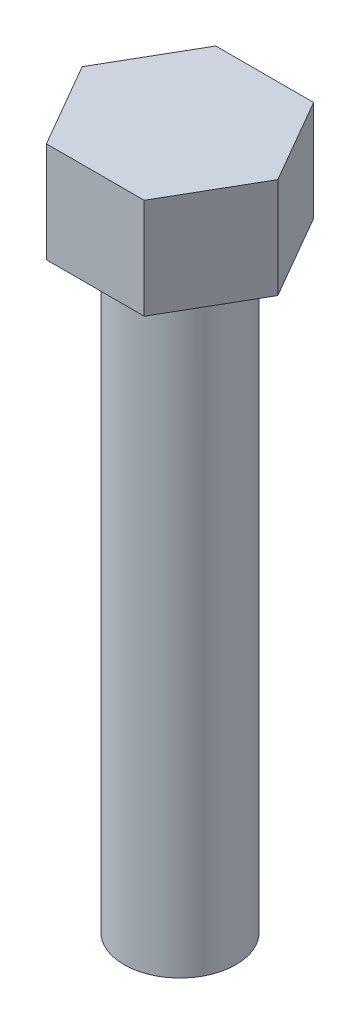
ISO-10303-21;
HEADER;
FILE_DESCRIPTION(('STEP AP214'),'2;1');
FILE_NAME('part.step','',(''),(''),'','','');
FILE_SCHEMA(('AUTOMOTIVE_DESIGN { 1 0 10303 214 1 1 1 1 }'));
ENDSEC;
DATA;
#1=APPLICATION_CONTEXT('core data for automotive mechanical design processes');
#2=APPLICATION_PROTOCOL_DEFINITION('international standard','automotive_design',2000,#1);
#3=PRODUCT_CONTEXT('',#1,'mechanical');
#4=PRODUCT('Part','Part','',(#3));
#5=PRODUCT_RELATED_PRODUCT_CATEGORY('part','',(#4));
#6=PRODUCT_DEFINITION_FORMATION('','',#4);
#7=PRODUCT_DEFINITION_CONTEXT('part definition',#1,'design');
#8=PRODUCT_DEFINITION('design','',#6,#7);
#9=PRODUCT_DEFINITION_SHAPE('','',#8);
#10=(LENGTH_UNIT() NAMED_UNIT(*) SI_UNIT(.MILLI.,.METRE.));
#11=(NAMED_UNIT(*) PLANE_ANGLE_UNIT() SI_UNIT($,.RADIAN.));
#12=(NAMED_UNIT(*) SI_UNIT($,.STERADIAN.) SOLID_ANGLE_UNIT());
#13=UNCERTAINTY_MEASURE_WITH_UNIT(LENGTH_MEASURE(1.E-05),#10,'distance_accuracy_value','');
#14=(GEOMETRIC_REPRESENTATION_CONTEXT(3) GLOBAL_UNCERTAINTY_ASSIGNED_CONTEXT((#13)) GLOBAL_UNIT_ASSIGNED_CONTEXT((#10,
#11,#12)) REPRESENTATION_CONTEXT('',''));
#15=CARTESIAN_POINT('',(0.,0.,0.));
#16=DIRECTION('',(0.,0.,1.));
#17=DIRECTION('',(1.,0.,0.));
#18=AXIS2_PLACEMENT_3D('',#15,#16,#17);
#19=CARTESIAN_POINT('',(2.33749999999999,4.8,-4.04866876269225));
#20=DIRECTION('',(0.,0.,1.));
#21=DIRECTION('',(1.,0.,0.));
#22=AXIS2_PLACEMENT_3D('',#19,#20,#21);
#23=PLANE('',#22);
#24=DIRECTION('',(-1.,0.,0.));
#25=VECTOR('',#24,1.);
#26=CARTESIAN_POINT('',(2.33749999999999,0.,-4.04866876269225));
#27=LINE('',#26,#25);
#28=CARTESIAN_POINT('',(2.33749999999999,0.,-4.04866876269225));
#29=VERTEX_POINT('',#28);
#30=CARTESIAN_POINT('',(-2.33749999999999,0.,-4.04866876269225));
#31=VERTEX_POINT('',#30);
#32=EDGE_CURVE('E129',#29,#31,#27,.T.);
#33=ORIENTED_EDGE('',*,*,#32,.T.);
#34=DIRECTION('',(0.,-1.,0.));
#35=VECTOR('',#34,1.);
#36=CARTESIAN_POINT('',(-2.33749999999999,4.8,-4.04866876269225));
#37=LINE('',#36,#35);
#38=CARTESIAN_POINT('',(-2.33749999999999,4.8,-4.04866876269225));
#39=VERTEX_POINT('',#38);
#40=EDGE_CURVE('E147',#39,#31,#37,.T.);
#41=ORIENTED_EDGE('',*,*,#40,.F.);
#42=DIRECTION('',(-1.,0.,0.));
#43=VECTOR('',#42,1.);
#44=CARTESIAN_POINT('',(2.33749999999999,4.8,-4.04866876269225));
#45=LINE('',#44,#43);
#46=CARTESIAN_POINT('',(2.33749999999999,4.8,-4.04866876269225));
#47=VERTEX_POINT('',#46);
#48=EDGE_CURVE('E140',#47,#39,#45,.T.);
#49=ORIENTED_EDGE('',*,*,#48,.F.);
#50=DIRECTION('',(0.,-1.,0.));
#51=VECTOR('',#50,1.);
#52=CARTESIAN_POINT('',(2.33749999999999,4.8,-4.04866876269225));
#53=LINE('',#52,#51);
#54=EDGE_CURVE('E125',#47,#29,#53,.T.);
#55=ORIENTED_EDGE('',*,*,#54,.T.);
#56=EDGE_LOOP('',(#33,#41,#49,#55));
#57=FACE_BOUND('',#56,.T.);
#58=ADVANCED_FACE('F43',(#57),#23,.F.);
#59=CARTESIAN_POINT('',(-2.33749999999999,4.8,-4.04866876269225));
#60=DIRECTION('',(0.866025403784438,0.,0.500000000000001));
#61=DIRECTION('',(0.500000000000001,0.,-0.866025403784438));
#62=AXIS2_PLACEMENT_3D('',#59,#60,#61);
#63=PLANE('',#62);
#64=DIRECTION('',(-0.500000000000001,0.,0.866025403784438));
#65=VECTOR('',#64,1.);
#66=CARTESIAN_POINT('',(-2.33749999999999,0.,-4.04866876269225));
#67=LINE('',#66,#65);
#68=CARTESIAN_POINT('',(-4.675,0.,0.));
#69=VERTEX_POINT('',#68);
#70=EDGE_CURVE('E132',#31,#69,#67,.T.);
#71=ORIENTED_EDGE('',*,*,#70,.T.);
#72=DIRECTION('',(0.,-1.,0.));
#73=VECTOR('',#72,1.);
#74=CARTESIAN_POINT('',(-4.675,4.8,0.));
#75=LINE('',#74,#73);
#76=CARTESIAN_POINT('',(-4.675,4.8,0.));
#77=VERTEX_POINT('',#76);
#78=EDGE_CURVE('E144',#77,#69,#75,.T.);
#79=ORIENTED_EDGE('',*,*,#78,.F.);
#80=DIRECTION('',(-0.500000000000001,0.,0.866025403784438));
#81=VECTOR('',#80,1.);
#82=CARTESIAN_POINT('',(-2.33749999999999,4.8,-4.04866876269225));
#83=LINE('',#82,#81);
#84=EDGE_CURVE('E98',#39,#77,#83,.T.);
#85=ORIENTED_EDGE('',*,*,#84,.F.);
#86=ORIENTED_EDGE('',*,*,#40,.T.);
#87=EDGE_LOOP('',(#71,#79,#85,#86));
#88=FACE_BOUND('',#87,.T.);
#89=ADVANCED_FACE('F165',(#88),#63,.F.);
#90=CARTESIAN_POINT('',(-4.675,4.8,0.));
#91=DIRECTION('',(0.866025403784438,0.,-0.500000000000001));
#92=DIRECTION('',(-0.500000000000001,0.,-0.866025403784438));
#93=AXIS2_PLACEMENT_3D('',#90,#91,#92);
#94=PLANE('',#93);
#95=DIRECTION('',(0.500000000000001,0.,0.866025403784438));
#96=VECTOR('',#95,1.);
#97=CARTESIAN_POINT('',(-4.675,0.,0.));
#98=LINE('',#97,#96);
#99=CARTESIAN_POINT('',(-2.33749999999999,0.,4.04866876269225));
#100=VERTEX_POINT('',#99);
#101=EDGE_CURVE('E135',#69,#100,#98,.T.);
#102=ORIENTED_EDGE('',*,*,#101,.T.);
#103=DIRECTION('',(0.,-1.,0.));
#104=VECTOR('',#103,1.);
#105=CARTESIAN_POINT('',(-2.33749999999999,4.8,4.04866876269225));
#106=LINE('',#105,#104);
#107=CARTESIAN_POINT('',(-2.33749999999999,4.8,4.04866876269225));
#108=VERTEX_POINT('',#107);
#109=EDGE_CURVE('E120',#108,#100,#106,.T.);
#110=ORIENTED_EDGE('',*,*,#109,.F.);
#111=DIRECTION('',(0.500000000000001,0.,0.866025403784438));
#112=VECTOR('',#111,1.);
#113=CARTESIAN_POINT('',(-4.675,4.8,0.));
#114=LINE('',#113,#112);
#115=EDGE_CURVE('E111',#77,#108,#114,.T.);
#116=ORIENTED_EDGE('',*,*,#115,.F.);
#117=ORIENTED_EDGE('',*,*,#78,.T.);
#118=EDGE_LOOP('',(#102,#110,#116,#117));
#119=FACE_BOUND('',#118,.T.);
#120=ADVANCED_FACE('F170',(#119),#94,.F.);
#121=CARTESIAN_POINT('',(-2.33749999999999,4.8,4.04866876269225));
#122=DIRECTION('',(0.,0.,-1.));
#123=DIRECTION('',(-1.,0.,0.));
#124=AXIS2_PLACEMENT_3D('',#121,#122,#123);
#125=PLANE('',#124);
#126=DIRECTION('',(1.,0.,0.));
#127=VECTOR('',#126,1.);
#128=CARTESIAN_POINT('',(-2.33749999999999,0.,4.04866876269225));
#129=LINE('',#128,#127);
#130=CARTESIAN_POINT('',(2.33749999999999,0.,4.04866876269225));
#131=VERTEX_POINT('',#130);
#132=EDGE_CURVE('E119',#100,#131,#129,.T.);
#133=ORIENTED_EDGE('',*,*,#132,.T.);
#134=DIRECTION('',(0.,-1.,0.));
#135=VECTOR('',#134,1.);
#136=CARTESIAN_POINT('',(2.33749999999999,4.8,4.04866876269225));
#137=LINE('',#136,#135);
#138=CARTESIAN_POINT('',(2.33749999999999,4.8,4.04866876269225));
#139=VERTEX_POINT('',#138);
#140=EDGE_CURVE('E116',#139,#131,#137,.T.);
#141=ORIENTED_EDGE('',*,*,#140,.F.);
#142=DIRECTION('',(1.,0.,0.));
#143=VECTOR('',#142,1.);
#144=CARTESIAN_POINT('',(-2.33749999999999,4.8,4.04866876269225));
#145=LINE('',#144,#143);
#146=EDGE_CURVE('E105',#108,#139,#145,.T.);
#147=ORIENTED_EDGE('',*,*,#146,.F.);
#148=ORIENTED_EDGE('',*,*,#109,.T.);
#149=EDGE_LOOP('',(#133,#141,#147,#148));
#150=FACE_BOUND('',#149,.T.);
#151=ADVANCED_FACE('F117',(#150),#125,.F.);
#152=CARTESIAN_POINT('',(2.33749999999999,4.8,4.04866876269225));
#153=DIRECTION('',(-0.866025403784439,0.,-0.499999999999999));
#154=DIRECTION('',(-0.499999999999999,0.,0.866025403784439));
#155=AXIS2_PLACEMENT_3D('',#152,#153,#154);
#156=PLANE('',#155);
#157=DIRECTION('',(0.499999999999999,0.,-0.866025403784439));
#158=VECTOR('',#157,1.);
#159=CARTESIAN_POINT('',(2.33749999999999,0.,4.04866876269225));
#160=LINE('',#159,#158);
#161=CARTESIAN_POINT('',(4.67499999999998,0.,0.));
#162=VERTEX_POINT('',#161);
#163=EDGE_CURVE('E83',#131,#162,#160,.T.);
#164=ORIENTED_EDGE('',*,*,#163,.T.);
#165=DIRECTION('',(0.,-1.,0.));
#166=VECTOR('',#165,1.);
#167=CARTESIAN_POINT('',(4.67499999999998,4.8,0.));
#168=LINE('',#167,#166);
#169=CARTESIAN_POINT('',(4.67499999999998,4.8,0.));
#170=VERTEX_POINT('',#169);
#171=EDGE_CURVE('E121',#170,#162,#168,.T.);
#172=ORIENTED_EDGE('',*,*,#171,.F.);
#173=DIRECTION('',(0.499999999999999,0.,-0.866025403784439));
#174=VECTOR('',#173,1.);
#175=CARTESIAN_POINT('',(2.33749999999999,4.8,4.04866876269225));
#176=LINE('',#175,#174);
#177=EDGE_CURVE('E109',#139,#170,#176,.T.);
#178=ORIENTED_EDGE('',*,*,#177,.F.);
#179=ORIENTED_EDGE('',*,*,#140,.T.);
#180=EDGE_LOOP('',(#164,#172,#178,#179));
#181=FACE_BOUND('',#180,.T.);
#182=ADVANCED_FACE('F123',(#181),#156,.F.);
#183=CARTESIAN_POINT('',(4.67499999999998,4.8,0.));
#184=DIRECTION('',(-0.866025403784439,0.,0.499999999999999));
#185=DIRECTION('',(0.499999999999999,0.,0.866025403784439));
#186=AXIS2_PLACEMENT_3D('',#183,#184,#185);
#187=PLANE('',#186);
#188=DIRECTION('',(-0.499999999999999,0.,-0.866025403784439));
#189=VECTOR('',#188,1.);
#190=CARTESIAN_POINT('',(4.67499999999998,0.,0.));
#191=LINE('',#190,#189);
#192=EDGE_CURVE('E89',#162,#29,#191,.T.);
#193=ORIENTED_EDGE('',*,*,#192,.T.);
#194=ORIENTED_EDGE('',*,*,#54,.F.);
#195=DIRECTION('',(-0.499999999999999,0.,-0.866025403784439));
#196=VECTOR('',#195,1.);
#197=CARTESIAN_POINT('',(4.67499999999998,4.8,0.));
#198=LINE('',#197,#196);
#199=EDGE_CURVE('E60',#170,#47,#198,.T.);
#200=ORIENTED_EDGE('',*,*,#199,.F.);
#201=ORIENTED_EDGE('',*,*,#171,.T.);
#202=EDGE_LOOP('',(#193,#194,#200,#201));
#203=FACE_BOUND('',#202,.T.);
#204=ADVANCED_FACE('F180',(#203),#187,.F.);
#205=CARTESIAN_POINT('',(0.,4.8,0.));
#206=DIRECTION('',(0.,1.,0.));
#207=DIRECTION('',(0.,0.,1.));
#208=AXIS2_PLACEMENT_3D('',#205,#206,#207);
#209=PLANE('',#208);
#210=ORIENTED_EDGE('',*,*,#48,.T.);
#211=ORIENTED_EDGE('',*,*,#84,.T.);
#212=ORIENTED_EDGE('',*,*,#115,.T.);
#213=ORIENTED_EDGE('',*,*,#146,.T.);
#214=ORIENTED_EDGE('',*,*,#177,.T.);
#215=ORIENTED_EDGE('',*,*,#199,.T.);
#216=EDGE_LOOP('',(#210,#211,#212,#213,#214,#215));
#217=FACE_BOUND('',#216,.T.);
#218=ADVANCED_FACE('F107',(#217),#209,.T.);
#219=CARTESIAN_POINT('',(0.,0.,0.));
#220=DIRECTION('',(0.,1.,0.));
#221=DIRECTION('',(0.,0.,1.));
#222=AXIS2_PLACEMENT_3D('',#219,#220,#221);
#223=PLANE('',#222);
#224=CARTESIAN_POINT('',(0.,0.,0.));
#225=DIRECTION('',(0.,1.,0.));
#226=DIRECTION('',(0.,0.,1.));
#227=AXIS2_PLACEMENT_3D('',#224,#225,#226);
#228=CIRCLE('',#227,2.925);
#229=CARTESIAN_POINT('',(0.,0.,2.925));
#230=VERTEX_POINT('',#229);
#231=EDGE_CURVE('E11',#230,#230,#228,.T.);
#232=ORIENTED_EDGE('',*,*,#231,.T.);
#233=EDGE_LOOP('',(#232));
#234=FACE_BOUND('',#233,.T.);
#235=ORIENTED_EDGE('',*,*,#32,.F.);
#236=ORIENTED_EDGE('',*,*,#192,.F.);
#237=ORIENTED_EDGE('',*,*,#163,.F.);
#238=ORIENTED_EDGE('',*,*,#132,.F.);
#239=ORIENTED_EDGE('',*,*,#101,.F.);
#240=ORIENTED_EDGE('',*,*,#70,.F.);
#241=EDGE_LOOP('',(#235,#236,#237,#238,#239,#240));
#242=FACE_BOUND('',#241,.T.);
#243=ADVANCED_FACE('F183',(#234,#242),#223,.F.);
#244=CARTESIAN_POINT('',(0.,-28.7,0.));
#245=DIRECTION('',(0.,1.,0.));
#246=DIRECTION('',(0.,0.,1.));
#247=AXIS2_PLACEMENT_3D('',#244,#245,#246);
#248=CYLINDRICAL_SURFACE('',#247,2.675);
#249=CARTESIAN_POINT('',(0.,-0.25,0.));
#250=DIRECTION('',(0.,1.,0.));
#251=DIRECTION('',(0.,0.,1.));
#252=AXIS2_PLACEMENT_3D('',#249,#250,#251);
#253=CIRCLE('',#252,2.675);
#254=CARTESIAN_POINT('',(0.,-0.25,2.675));
#255=VERTEX_POINT('',#254);
#256=EDGE_CURVE('E52',#255,#255,#253,.F.);
#257=ORIENTED_EDGE('',*,*,#256,.T.);
#258=EDGE_LOOP('',(#257));
#259=FACE_BOUND('',#258,.T.);
#260=CARTESIAN_POINT('',(0.,-28.7,0.));
#261=DIRECTION('',(0.,-1.,0.));
#262=DIRECTION('',(0.,0.,-1.));
#263=AXIS2_PLACEMENT_3D('',#260,#261,#262);
#264=CIRCLE('',#263,2.675);
#265=CARTESIAN_POINT('',(0.,-28.7,-2.675));
#266=VERTEX_POINT('',#265);
#267=EDGE_CURVE('E133',#266,#266,#264,.T.);
#268=ORIENTED_EDGE('',*,*,#267,.F.);
#269=EDGE_LOOP('',(#268));
#270=FACE_BOUND('',#269,.T.);
#271=ADVANCED_FACE('F151',(#259,#270),#248,.T.);
#272=CARTESIAN_POINT('',(0.,-28.7,0.));
#273=DIRECTION('',(0.,-1.,0.));
#274=DIRECTION('',(0.,0.,-1.));
#275=AXIS2_PLACEMENT_3D('',#272,#273,#274);
#276=PLANE('',#275);
#277=ORIENTED_EDGE('',*,*,#267,.T.);
#278=EDGE_LOOP('',(#277));
#279=FACE_BOUND('',#278,.T.);
#280=ADVANCED_FACE('F155',(#279),#276,.T.);
#281=CARTESIAN_POINT('',(0.,-0.25,0.));
#282=DIRECTION('',(0.,1.,0.));
#283=DIRECTION('',(0.,0.,1.));
#284=AXIS2_PLACEMENT_3D('',#281,#282,#283);
#285=TOROIDAL_SURFACE('',#284,2.925,0.25);
#286=ORIENTED_EDGE('',*,*,#231,.F.);
#287=EDGE_LOOP('',(#286));
#288=FACE_BOUND('',#287,.T.);
#289=ORIENTED_EDGE('',*,*,#256,.F.);
#290=EDGE_LOOP('',(#289));
#291=FACE_BOUND('',#290,.T.);
#292=ADVANCED_FACE('F45',(#288,#291),#285,.F.);
#293=CLOSED_SHELL('',(#58,#89,#120,#151,#182,#204,#218,#243,#271,#280,#292));
#294=MANIFOLD_SOLID_BREP('B2',#293);
#295=ADVANCED_BREP_SHAPE_REPRESENTATION('',(#18,#294),#14);
#296=SHAPE_DEFINITION_REPRESENTATION(#9,#295);
ENDSEC;
END-ISO-10303-21;
